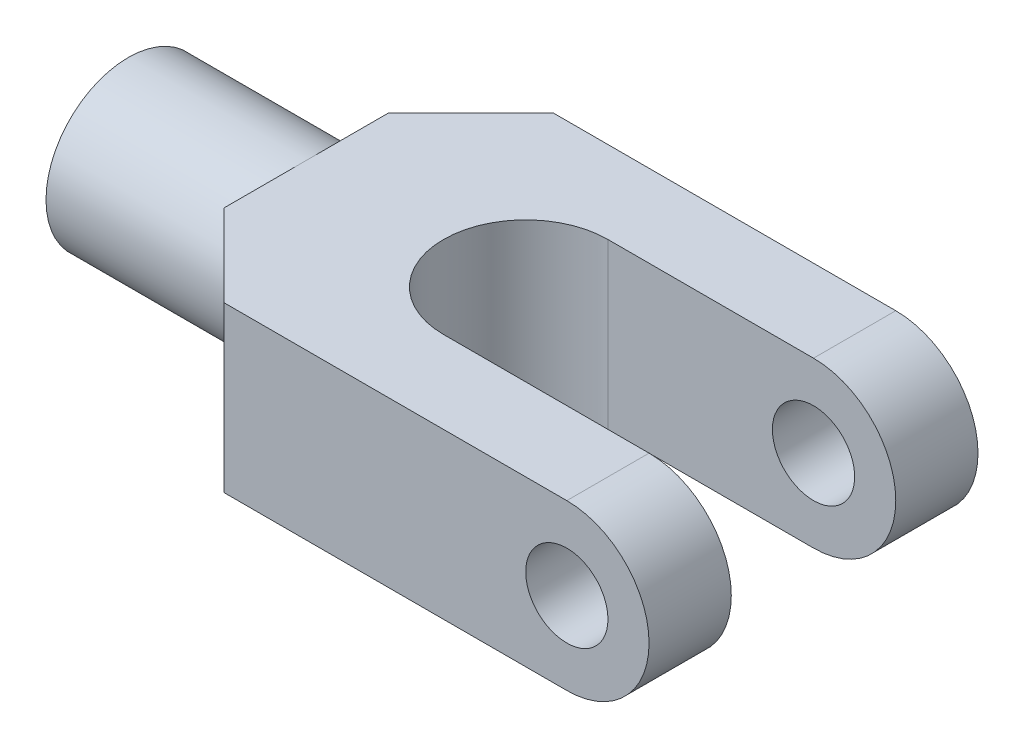
ISO-10303-21;
HEADER;
FILE_DESCRIPTION(('STEP AP214'),'2;1');
FILE_NAME('part.step','',(''),(''),'','','');
FILE_SCHEMA(('AUTOMOTIVE_DESIGN { 1 0 10303 214 1 1 1 1 }'));
ENDSEC;
DATA;
#1=APPLICATION_CONTEXT('core data for automotive mechanical design processes');
#2=APPLICATION_PROTOCOL_DEFINITION('international standard','automotive_design',2000,#1);
#3=PRODUCT_CONTEXT('',#1,'mechanical');
#4=PRODUCT('Part','Part','',(#3));
#5=PRODUCT_RELATED_PRODUCT_CATEGORY('part','',(#4));
#6=PRODUCT_DEFINITION_FORMATION('','',#4);
#7=PRODUCT_DEFINITION_CONTEXT('part definition',#1,'design');
#8=PRODUCT_DEFINITION('design','',#6,#7);
#9=PRODUCT_DEFINITION_SHAPE('','',#8);
#10=(LENGTH_UNIT() NAMED_UNIT(*) SI_UNIT(.MILLI.,.METRE.));
#11=(NAMED_UNIT(*) PLANE_ANGLE_UNIT() SI_UNIT($,.RADIAN.));
#12=(NAMED_UNIT(*) SI_UNIT($,.STERADIAN.) SOLID_ANGLE_UNIT());
#13=UNCERTAINTY_MEASURE_WITH_UNIT(LENGTH_MEASURE(1.E-05),#10,'distance_accuracy_value','');
#14=(GEOMETRIC_REPRESENTATION_CONTEXT(3) GLOBAL_UNCERTAINTY_ASSIGNED_CONTEXT((#13)) GLOBAL_UNIT_ASSIGNED_CONTEXT((#10,
#11,#12)) REPRESENTATION_CONTEXT('',''));
#15=CARTESIAN_POINT('',(0.,0.,0.));
#16=DIRECTION('',(0.,0.,1.));
#17=DIRECTION('',(1.,0.,0.));
#18=AXIS2_PLACEMENT_3D('',#15,#16,#17);
#19=CARTESIAN_POINT('',(-31.,-6.,12.));
#20=DIRECTION('',(1.,0.,0.));
#21=DIRECTION('',(0.,0.,-1.));
#22=AXIS2_PLACEMENT_3D('',#19,#20,#21);
#23=PLANE('',#22);
#24=CARTESIAN_POINT('',(-31.,0.,0.));
#25=DIRECTION('',(-1.,0.,0.));
#26=DIRECTION('',(0.,0.,1.));
#27=AXIS2_PLACEMENT_3D('',#24,#25,#26);
#28=CIRCLE('',#27,6.);
#29=CARTESIAN_POINT('',(-31.,0.,6.));
#30=VERTEX_POINT('',#29);
#31=CARTESIAN_POINT('',(-31.,6.,0.));
#32=VERTEX_POINT('',#31);
#33=EDGE_CURVE('E49',#30,#32,#28,.T.);
#34=ORIENTED_EDGE('',*,*,#33,.F.);
#35=DIRECTION('',(0.,1.,0.));
#36=VECTOR('',#35,1.);
#37=CARTESIAN_POINT('',(-31.,-6.,6.00000000000001));
#38=LINE('',#37,#36);
#39=CARTESIAN_POINT('',(-31.,6.,6.00000000000001));
#40=VERTEX_POINT('',#39);
#41=EDGE_CURVE('E136',#30,#40,#38,.T.);
#42=ORIENTED_EDGE('',*,*,#41,.T.);
#43=DIRECTION('',(0.,0.,-1.));
#44=VECTOR('',#43,1.);
#45=CARTESIAN_POINT('',(-31.,6.,12.));
#46=LINE('',#45,#44);
#47=EDGE_CURVE('E148',#40,#32,#46,.T.);
#48=ORIENTED_EDGE('',*,*,#47,.T.);
#49=EDGE_LOOP('',(#34,#42,#48));
#50=FACE_BOUND('',#49,.T.);
#51=ADVANCED_FACE('F38',(#50),#23,.F.);
#52=CARTESIAN_POINT('',(-31.,0.,-6.));
#53=VERTEX_POINT('',#52);
#54=EDGE_CURVE('E11',#32,#53,#28,.T.);
#55=ORIENTED_EDGE('',*,*,#54,.F.);
#56=CARTESIAN_POINT('',(-31.,6.,-6.));
#57=VERTEX_POINT('',#56);
#58=EDGE_CURVE('E232',#32,#57,#46,.T.);
#59=ORIENTED_EDGE('',*,*,#58,.T.);
#60=DIRECTION('',(0.,1.,0.));
#61=VECTOR('',#60,1.);
#62=CARTESIAN_POINT('',(-31.,-6.,-6.));
#63=LINE('',#62,#61);
#64=EDGE_CURVE('E188',#53,#57,#63,.T.);
#65=ORIENTED_EDGE('',*,*,#64,.F.);
#66=EDGE_LOOP('',(#55,#59,#65));
#67=FACE_BOUND('',#66,.T.);
#68=ADVANCED_FACE('F263',(#67),#23,.F.);
#69=CARTESIAN_POINT('',(-31.,-6.,0.));
#70=VERTEX_POINT('',#69);
#71=EDGE_CURVE('E47',#53,#70,#28,.T.);
#72=ORIENTED_EDGE('',*,*,#71,.F.);
#73=CARTESIAN_POINT('',(-31.,-6.,-6.));
#74=VERTEX_POINT('',#73);
#75=EDGE_CURVE('E191',#74,#53,#63,.T.);
#76=ORIENTED_EDGE('',*,*,#75,.F.);
#77=DIRECTION('',(0.,0.,-1.));
#78=VECTOR('',#77,1.);
#79=CARTESIAN_POINT('',(-31.,-6.,12.));
#80=LINE('',#79,#78);
#81=EDGE_CURVE('E230',#70,#74,#80,.T.);
#82=ORIENTED_EDGE('',*,*,#81,.F.);
#83=EDGE_LOOP('',(#72,#76,#82));
#84=FACE_BOUND('',#83,.T.);
#85=ADVANCED_FACE('F269',(#84),#23,.F.);
#86=CARTESIAN_POINT('',(0.,0.,12.));
#87=DIRECTION('',(0.,0.,-1.));
#88=DIRECTION('',(-1.,0.,0.));
#89=AXIS2_PLACEMENT_3D('',#86,#87,#88);
#90=CYLINDRICAL_SURFACE('',#89,6.);
#91=DIRECTION('',(0.,0.,-1.));
#92=VECTOR('',#91,1.);
#93=CARTESIAN_POINT('',(0.,6.,12.));
#94=LINE('',#93,#92);
#95=CARTESIAN_POINT('',(0.,6.,-6.));
#96=VERTEX_POINT('',#95);
#97=CARTESIAN_POINT('',(0.,6.,-12.));
#98=VERTEX_POINT('',#97);
#99=EDGE_CURVE('E155',#96,#98,#94,.T.);
#100=ORIENTED_EDGE('',*,*,#99,.F.);
#101=CARTESIAN_POINT('',(0.,0.,-6.));
#102=DIRECTION('',(0.,0.,-1.));
#103=DIRECTION('',(-1.,0.,0.));
#104=AXIS2_PLACEMENT_3D('',#101,#102,#103);
#105=CIRCLE('',#104,6.);
#106=CARTESIAN_POINT('',(0.,-6.,-6.));
#107=VERTEX_POINT('',#106);
#108=EDGE_CURVE('E201',#96,#107,#105,.T.);
#109=ORIENTED_EDGE('',*,*,#108,.T.);
#110=DIRECTION('',(0.,0.,-1.));
#111=VECTOR('',#110,1.);
#112=CARTESIAN_POINT('',(0.,-6.,12.));
#113=LINE('',#112,#111);
#114=CARTESIAN_POINT('',(0.,-6.,-12.));
#115=VERTEX_POINT('',#114);
#116=EDGE_CURVE('E219',#107,#115,#113,.T.);
#117=ORIENTED_EDGE('',*,*,#116,.T.);
#118=CARTESIAN_POINT('',(0.,0.,-12.));
#119=DIRECTION('',(0.,0.,1.));
#120=DIRECTION('',(1.,0.,0.));
#121=AXIS2_PLACEMENT_3D('',#118,#119,#120);
#122=CIRCLE('',#121,6.);
#123=EDGE_CURVE('E207',#115,#98,#122,.T.);
#124=ORIENTED_EDGE('',*,*,#123,.T.);
#125=EDGE_LOOP('',(#100,#109,#117,#124));
#126=FACE_BOUND('',#125,.T.);
#127=ADVANCED_FACE('F259',(#126),#90,.T.);
#128=CARTESIAN_POINT('',(0.,0.,12.));
#129=DIRECTION('',(0.,0.,-1.));
#130=DIRECTION('',(-1.,0.,0.));
#131=AXIS2_PLACEMENT_3D('',#128,#129,#130);
#132=CYLINDRICAL_SURFACE('',#131,3.);
#133=CARTESIAN_POINT('',(0.,0.,-6.));
#134=DIRECTION('',(0.,0.,-1.));
#135=DIRECTION('',(-1.,0.,0.));
#136=AXIS2_PLACEMENT_3D('',#133,#134,#135);
#137=CIRCLE('',#136,3.);
#138=CARTESIAN_POINT('',(-3.,0.,-6.));
#139=VERTEX_POINT('',#138);
#140=EDGE_CURVE('E42',#139,#139,#137,.T.);
#141=ORIENTED_EDGE('',*,*,#140,.F.);
#142=EDGE_LOOP('',(#141));
#143=FACE_BOUND('',#142,.T.);
#144=CARTESIAN_POINT('',(0.,0.,-12.));
#145=DIRECTION('',(0.,0.,1.));
#146=DIRECTION('',(1.,0.,0.));
#147=AXIS2_PLACEMENT_3D('',#144,#145,#146);
#148=CIRCLE('',#147,3.);
#149=CARTESIAN_POINT('',(3.,0.,-12.));
#150=VERTEX_POINT('',#149);
#151=EDGE_CURVE('E203',#150,#150,#148,.T.);
#152=ORIENTED_EDGE('',*,*,#151,.F.);
#153=EDGE_LOOP('',(#152));
#154=FACE_BOUND('',#153,.T.);
#155=ADVANCED_FACE('F245',(#143,#154),#132,.F.);
#156=CARTESIAN_POINT('',(0.,0.,12.));
#157=DIRECTION('',(0.,0.,1.));
#158=DIRECTION('',(1.,0.,0.));
#159=AXIS2_PLACEMENT_3D('',#156,#157,#158);
#160=PLANE('',#159);
#161=DIRECTION('',(0.,1.,0.));
#162=VECTOR('',#161,1.);
#163=CARTESIAN_POINT('',(-25.,-6.,12.));
#164=LINE('',#163,#162);
#165=CARTESIAN_POINT('',(-25.,-6.,12.));
#166=VERTEX_POINT('',#165);
#167=CARTESIAN_POINT('',(-25.,6.,12.));
#168=VERTEX_POINT('',#167);
#169=EDGE_CURVE('E146',#166,#168,#164,.T.);
#170=ORIENTED_EDGE('',*,*,#169,.F.);
#171=DIRECTION('',(1.,0.,0.));
#172=VECTOR('',#171,1.);
#173=CARTESIAN_POINT('',(0.,-6.,12.));
#174=LINE('',#173,#172);
#175=CARTESIAN_POINT('',(0.,-6.,12.));
#176=VERTEX_POINT('',#175);
#177=EDGE_CURVE('E217',#166,#176,#174,.T.);
#178=ORIENTED_EDGE('',*,*,#177,.T.);
#179=CARTESIAN_POINT('',(0.,0.,12.));
#180=DIRECTION('',(0.,0.,1.));
#181=DIRECTION('',(1.,0.,0.));
#182=AXIS2_PLACEMENT_3D('',#179,#180,#181);
#183=CIRCLE('',#182,6.);
#184=CARTESIAN_POINT('',(0.,6.,12.));
#185=VERTEX_POINT('',#184);
#186=EDGE_CURVE('E210',#176,#185,#183,.T.);
#187=ORIENTED_EDGE('',*,*,#186,.T.);
#188=DIRECTION('',(-1.,0.,0.));
#189=VECTOR('',#188,1.);
#190=CARTESIAN_POINT('',(-31.,6.,12.));
#191=LINE('',#190,#189);
#192=EDGE_CURVE('E213',#185,#168,#191,.T.);
#193=ORIENTED_EDGE('',*,*,#192,.T.);
#194=EDGE_LOOP('',(#170,#178,#187,#193));
#195=FACE_BOUND('',#194,.T.);
#196=CARTESIAN_POINT('',(0.,0.,12.));
#197=DIRECTION('',(0.,0.,1.));
#198=DIRECTION('',(1.,0.,0.));
#199=AXIS2_PLACEMENT_3D('',#196,#197,#198);
#200=CIRCLE('',#199,3.);
#201=CARTESIAN_POINT('',(3.,0.,12.));
#202=VERTEX_POINT('',#201);
#203=EDGE_CURVE('E204',#202,#202,#200,.T.);
#204=ORIENTED_EDGE('',*,*,#203,.F.);
#205=EDGE_LOOP('',(#204));
#206=FACE_BOUND('',#205,.T.);
#207=ADVANCED_FACE('F248',(#195,#206),#160,.T.);
#208=CARTESIAN_POINT('',(0.,0.,-12.));
#209=DIRECTION('',(0.,0.,1.));
#210=DIRECTION('',(1.,0.,0.));
#211=AXIS2_PLACEMENT_3D('',#208,#209,#210);
#212=PLANE('',#211);
#213=DIRECTION('',(1.,0.,0.));
#214=VECTOR('',#213,1.);
#215=CARTESIAN_POINT('',(0.,-6.,-12.));
#216=LINE('',#215,#214);
#217=CARTESIAN_POINT('',(-25.,-6.,-12.));
#218=VERTEX_POINT('',#217);
#219=EDGE_CURVE('E214',#218,#115,#216,.T.);
#220=ORIENTED_EDGE('',*,*,#219,.F.);
#221=DIRECTION('',(0.,1.,0.));
#222=VECTOR('',#221,1.);
#223=CARTESIAN_POINT('',(-25.,-6.,-12.));
#224=LINE('',#223,#222);
#225=CARTESIAN_POINT('',(-25.,6.,-12.));
#226=VERTEX_POINT('',#225);
#227=EDGE_CURVE('E164',#218,#226,#224,.T.);
#228=ORIENTED_EDGE('',*,*,#227,.T.);
#229=DIRECTION('',(-1.,0.,0.));
#230=VECTOR('',#229,1.);
#231=CARTESIAN_POINT('',(-31.,6.,-12.));
#232=LINE('',#231,#230);
#233=EDGE_CURVE('E222',#98,#226,#232,.T.);
#234=ORIENTED_EDGE('',*,*,#233,.F.);
#235=ORIENTED_EDGE('',*,*,#123,.F.);
#236=EDGE_LOOP('',(#220,#228,#234,#235));
#237=FACE_BOUND('',#236,.T.);
#238=ORIENTED_EDGE('',*,*,#151,.T.);
#239=EDGE_LOOP('',(#238));
#240=FACE_BOUND('',#239,.T.);
#241=ADVANCED_FACE('F250',(#237,#240),#212,.F.);
#242=CARTESIAN_POINT('',(0.,0.,6.));
#243=DIRECTION('',(0.,0.,1.));
#244=DIRECTION('',(1.,0.,0.));
#245=AXIS2_PLACEMENT_3D('',#242,#243,#244);
#246=CIRCLE('',#245,6.);
#247=CARTESIAN_POINT('',(0.,-6.,6.));
#248=VERTEX_POINT('',#247);
#249=CARTESIAN_POINT('',(0.,6.,6.));
#250=VERTEX_POINT('',#249);
#251=EDGE_CURVE('E199',#248,#250,#246,.T.);
#252=ORIENTED_EDGE('',*,*,#251,.T.);
#253=EDGE_CURVE('E153',#185,#250,#94,.T.);
#254=ORIENTED_EDGE('',*,*,#253,.F.);
#255=ORIENTED_EDGE('',*,*,#186,.F.);
#256=EDGE_CURVE('E227',#176,#248,#113,.T.);
#257=ORIENTED_EDGE('',*,*,#256,.T.);
#258=EDGE_LOOP('',(#252,#254,#255,#257));
#259=FACE_BOUND('',#258,.T.);
#260=ADVANCED_FACE('F40',(#259),#90,.T.);
#261=CARTESIAN_POINT('',(-31.,6.,12.));
#262=DIRECTION('',(0.,-1.,0.));
#263=DIRECTION('',(1.,0.,0.));
#264=AXIS2_PLACEMENT_3D('',#261,#262,#263);
#265=PLANE('',#264);
#266=CARTESIAN_POINT('',(-15.,6.,0.));
#267=DIRECTION('',(0.,1.,0.));
#268=DIRECTION('',(0.,0.,-1.));
#269=AXIS2_PLACEMENT_3D('',#266,#267,#268);
#270=CIRCLE('',#269,6.);
#271=CARTESIAN_POINT('',(-14.9999999999942,6.,-6.));
#272=VERTEX_POINT('',#271);
#273=CARTESIAN_POINT('',(-14.9999999999942,6.,6.));
#274=VERTEX_POINT('',#273);
#275=EDGE_CURVE('E160',#272,#274,#270,.T.);
#276=ORIENTED_EDGE('',*,*,#275,.F.);
#277=DIRECTION('',(-1.,0.,0.));
#278=VECTOR('',#277,1.);
#279=CARTESIAN_POINT('',(-14.9999999999942,6.,-6.));
#280=LINE('',#279,#278);
#281=EDGE_CURVE('E167',#96,#272,#280,.T.);
#282=ORIENTED_EDGE('',*,*,#281,.F.);
#283=ORIENTED_EDGE('',*,*,#99,.T.);
#284=ORIENTED_EDGE('',*,*,#233,.T.);
#285=DIRECTION('',(0.707106781186547,0.,-0.707106781186548));
#286=VECTOR('',#285,1.);
#287=CARTESIAN_POINT('',(-31.,6.,-6.));
#288=LINE('',#287,#286);
#289=EDGE_CURVE('E135',#57,#226,#288,.T.);
#290=ORIENTED_EDGE('',*,*,#289,.F.);
#291=ORIENTED_EDGE('',*,*,#58,.F.);
#292=ORIENTED_EDGE('',*,*,#47,.F.);
#293=DIRECTION('',(-0.707106781186548,0.,-0.707106781186547));
#294=VECTOR('',#293,1.);
#295=CARTESIAN_POINT('',(-31.,6.,6.00000000000001));
#296=LINE('',#295,#294);
#297=EDGE_CURVE('E142',#168,#40,#296,.T.);
#298=ORIENTED_EDGE('',*,*,#297,.F.);
#299=ORIENTED_EDGE('',*,*,#192,.F.);
#300=ORIENTED_EDGE('',*,*,#253,.T.);
#301=DIRECTION('',(1.,0.,0.));
#302=VECTOR('',#301,1.);
#303=CARTESIAN_POINT('',(6.,6.,6.));
#304=LINE('',#303,#302);
#305=EDGE_CURVE('E163',#274,#250,#304,.T.);
#306=ORIENTED_EDGE('',*,*,#305,.F.);
#307=EDGE_LOOP('',(#276,#282,#283,#284,#290,#291,#292,#298,#299,#300,#306));
#308=FACE_BOUND('',#307,.T.);
#309=ADVANCED_FACE('F282',(#308),#265,.F.);
#310=EDGE_CURVE('E56',#70,#30,#28,.T.);
#311=ORIENTED_EDGE('',*,*,#310,.F.);
#312=CARTESIAN_POINT('',(-31.,-6.,6.00000000000001));
#313=VERTEX_POINT('',#312);
#314=EDGE_CURVE('E132',#313,#70,#80,.T.);
#315=ORIENTED_EDGE('',*,*,#314,.F.);
#316=EDGE_CURVE('E128',#313,#30,#38,.T.);
#317=ORIENTED_EDGE('',*,*,#316,.T.);
#318=EDGE_LOOP('',(#311,#315,#317));
#319=FACE_BOUND('',#318,.T.);
#320=ADVANCED_FACE('F130',(#319),#23,.F.);
#321=CARTESIAN_POINT('',(0.,-6.,12.));
#322=DIRECTION('',(0.,1.,0.));
#323=DIRECTION('',(-1.,0.,0.));
#324=AXIS2_PLACEMENT_3D('',#321,#322,#323);
#325=PLANE('',#324);
#326=ORIENTED_EDGE('',*,*,#116,.F.);
#327=DIRECTION('',(-1.,0.,0.));
#328=VECTOR('',#327,1.);
#329=CARTESIAN_POINT('',(-14.9999999999942,-6.,-6.));
#330=LINE('',#329,#328);
#331=CARTESIAN_POINT('',(-14.9999999999942,-6.,-6.));
#332=VERTEX_POINT('',#331);
#333=EDGE_CURVE('E175',#107,#332,#330,.T.);
#334=ORIENTED_EDGE('',*,*,#333,.T.);
#335=CARTESIAN_POINT('',(-15.,-6.,0.));
#336=DIRECTION('',(0.,1.,0.));
#337=DIRECTION('',(0.,0.,-1.));
#338=AXIS2_PLACEMENT_3D('',#335,#336,#337);
#339=CIRCLE('',#338,6.);
#340=CARTESIAN_POINT('',(-14.9999999999942,-6.,6.));
#341=VERTEX_POINT('',#340);
#342=EDGE_CURVE('E169',#332,#341,#339,.T.);
#343=ORIENTED_EDGE('',*,*,#342,.T.);
#344=DIRECTION('',(1.,0.,0.));
#345=VECTOR('',#344,1.);
#346=CARTESIAN_POINT('',(6.,-6.,6.));
#347=LINE('',#346,#345);
#348=EDGE_CURVE('E172',#341,#248,#347,.T.);
#349=ORIENTED_EDGE('',*,*,#348,.T.);
#350=ORIENTED_EDGE('',*,*,#256,.F.);
#351=ORIENTED_EDGE('',*,*,#177,.F.);
#352=DIRECTION('',(-0.707106781186548,0.,-0.707106781186547));
#353=VECTOR('',#352,1.);
#354=CARTESIAN_POINT('',(-31.,-6.,6.00000000000001));
#355=LINE('',#354,#353);
#356=EDGE_CURVE('E195',#166,#313,#355,.T.);
#357=ORIENTED_EDGE('',*,*,#356,.T.);
#358=ORIENTED_EDGE('',*,*,#314,.T.);
#359=ORIENTED_EDGE('',*,*,#81,.T.);
#360=DIRECTION('',(0.707106781186547,0.,-0.707106781186548));
#361=VECTOR('',#360,1.);
#362=CARTESIAN_POINT('',(-31.,-6.,-6.));
#363=LINE('',#362,#361);
#364=EDGE_CURVE('E185',#74,#218,#363,.T.);
#365=ORIENTED_EDGE('',*,*,#364,.T.);
#366=ORIENTED_EDGE('',*,*,#219,.T.);
#367=EDGE_LOOP('',(#326,#334,#343,#349,#350,#351,#357,#358,#359,#365,#366));
#368=FACE_BOUND('',#367,.T.);
#369=ADVANCED_FACE('F243',(#368),#325,.F.);
#370=CARTESIAN_POINT('',(0.,0.,6.));
#371=DIRECTION('',(0.,0.,1.));
#372=DIRECTION('',(1.,0.,0.));
#373=AXIS2_PLACEMENT_3D('',#370,#371,#372);
#374=CIRCLE('',#373,3.);
#375=CARTESIAN_POINT('',(3.,0.,6.));
#376=VERTEX_POINT('',#375);
#377=EDGE_CURVE('E182',#376,#376,#374,.T.);
#378=ORIENTED_EDGE('',*,*,#377,.F.);
#379=EDGE_LOOP('',(#378));
#380=FACE_BOUND('',#379,.T.);
#381=ORIENTED_EDGE('',*,*,#203,.T.);
#382=EDGE_LOOP('',(#381));
#383=FACE_BOUND('',#382,.T.);
#384=ADVANCED_FACE('F239',(#380,#383),#132,.F.);
#385=CARTESIAN_POINT('',(-14.9999999999942,-6.,-6.));
#386=DIRECTION('',(0.,0.,-1.));
#387=DIRECTION('',(-1.,0.,0.));
#388=AXIS2_PLACEMENT_3D('',#385,#386,#387);
#389=PLANE('',#388);
#390=ORIENTED_EDGE('',*,*,#140,.T.);
#391=EDGE_LOOP('',(#390));
#392=FACE_BOUND('',#391,.T.);
#393=ORIENTED_EDGE('',*,*,#281,.T.);
#394=DIRECTION('',(0.,1.,0.));
#395=VECTOR('',#394,1.);
#396=CARTESIAN_POINT('',(-14.9999999999942,-6.,-6.));
#397=LINE('',#396,#395);
#398=EDGE_CURVE('E179',#332,#272,#397,.T.);
#399=ORIENTED_EDGE('',*,*,#398,.F.);
#400=ORIENTED_EDGE('',*,*,#333,.F.);
#401=ORIENTED_EDGE('',*,*,#108,.F.);
#402=EDGE_LOOP('',(#393,#399,#400,#401));
#403=FACE_BOUND('',#402,.T.);
#404=ADVANCED_FACE('F242',(#392,#403),#389,.F.);
#405=CARTESIAN_POINT('',(6.,-6.,6.));
#406=DIRECTION('',(0.,0.,1.));
#407=DIRECTION('',(1.,0.,0.));
#408=AXIS2_PLACEMENT_3D('',#405,#406,#407);
#409=PLANE('',#408);
#410=ORIENTED_EDGE('',*,*,#377,.T.);
#411=EDGE_LOOP('',(#410));
#412=FACE_BOUND('',#411,.T.);
#413=ORIENTED_EDGE('',*,*,#251,.F.);
#414=ORIENTED_EDGE('',*,*,#348,.F.);
#415=DIRECTION('',(0.,1.,0.));
#416=VECTOR('',#415,1.);
#417=CARTESIAN_POINT('',(-14.9999999999942,-6.,6.));
#418=LINE('',#417,#416);
#419=EDGE_CURVE('E178',#341,#274,#418,.T.);
#420=ORIENTED_EDGE('',*,*,#419,.T.);
#421=ORIENTED_EDGE('',*,*,#305,.T.);
#422=EDGE_LOOP('',(#413,#414,#420,#421));
#423=FACE_BOUND('',#422,.T.);
#424=ADVANCED_FACE('F236',(#412,#423),#409,.F.);
#425=CARTESIAN_POINT('',(-15.,-6.,0.));
#426=DIRECTION('',(0.,1.,0.));
#427=DIRECTION('',(0.,0.,1.));
#428=AXIS2_PLACEMENT_3D('',#425,#426,#427);
#429=CYLINDRICAL_SURFACE('',#428,6.);
#430=ORIENTED_EDGE('',*,*,#419,.F.);
#431=ORIENTED_EDGE('',*,*,#342,.F.);
#432=ORIENTED_EDGE('',*,*,#398,.T.);
#433=ORIENTED_EDGE('',*,*,#275,.T.);
#434=EDGE_LOOP('',(#430,#431,#432,#433));
#435=FACE_BOUND('',#434,.T.);
#436=ADVANCED_FACE('F312',(#435),#429,.F.);
#437=CARTESIAN_POINT('',(-31.,-6.,6.00000000000001));
#438=DIRECTION('',(0.707106781186547,0.,-0.707106781186548));
#439=DIRECTION('',(-0.707106781186548,0.,-0.707106781186547));
#440=AXIS2_PLACEMENT_3D('',#437,#438,#439);
#441=PLANE('',#440);
#442=ORIENTED_EDGE('',*,*,#316,.F.);
#443=ORIENTED_EDGE('',*,*,#356,.F.);
#444=ORIENTED_EDGE('',*,*,#169,.T.);
#445=ORIENTED_EDGE('',*,*,#297,.T.);
#446=ORIENTED_EDGE('',*,*,#41,.F.);
#447=EDGE_LOOP('',(#442,#443,#444,#445,#446));
#448=FACE_BOUND('',#447,.T.);
#449=ADVANCED_FACE('F140',(#448),#441,.F.);
#450=CARTESIAN_POINT('',(-31.,-6.,-6.));
#451=DIRECTION('',(0.707106781186548,0.,0.707106781186547));
#452=DIRECTION('',(0.707106781186547,0.,-0.707106781186548));
#453=AXIS2_PLACEMENT_3D('',#450,#451,#452);
#454=PLANE('',#453);
#455=ORIENTED_EDGE('',*,*,#227,.F.);
#456=ORIENTED_EDGE('',*,*,#364,.F.);
#457=ORIENTED_EDGE('',*,*,#75,.T.);
#458=ORIENTED_EDGE('',*,*,#64,.T.);
#459=ORIENTED_EDGE('',*,*,#289,.T.);
#460=EDGE_LOOP('',(#455,#456,#457,#458,#459));
#461=FACE_BOUND('',#460,.T.);
#462=ADVANCED_FACE('F323',(#461),#454,.F.);
#463=CARTESIAN_POINT('',(-44.,0.,0.));
#464=DIRECTION('',(1.,0.,0.));
#465=DIRECTION('',(0.,0.,-1.));
#466=AXIS2_PLACEMENT_3D('',#463,#464,#465);
#467=CYLINDRICAL_SURFACE('',#466,3.);
#468=CARTESIAN_POINT('',(-44.,0.,0.));
#469=DIRECTION('',(-1.,0.,0.));
#470=DIRECTION('',(0.,0.,1.));
#471=AXIS2_PLACEMENT_3D('',#468,#469,#470);
#472=CIRCLE('',#471,3.);
#473=CARTESIAN_POINT('',(-44.,0.,-3.));
#474=VERTEX_POINT('',#473);
#475=EDGE_CURVE('E150',#474,#474,#472,.T.);
#476=CARTESIAN_POINT('',(-31.,0.,0.));
#477=DIRECTION('',(-1.,0.,0.));
#478=DIRECTION('',(0.,0.,1.));
#479=AXIS2_PLACEMENT_3D('',#476,#477,#478);
#480=CIRCLE('',#479,3.);
#481=CARTESIAN_POINT('',(-31.,0.,-3.));
#482=VERTEX_POINT('',#481);
#483=EDGE_CURVE('E151',#482,#482,#480,.T.);
#484=CARTESIAN_POINT('',(-44.,0.,-3.));
#485=CARTESIAN_POINT('',(-43.8645833333333,0.,-3.));
#486=CARTESIAN_POINT('',(-43.7291666666667,0.,-3.));
#487=CARTESIAN_POINT('',(-43.4583333333333,0.,-3.));
#488=CARTESIAN_POINT('',(-43.3229166666667,0.,-3.));
#489=CARTESIAN_POINT('',(-43.0520833333333,0.,-3.));
#490=CARTESIAN_POINT('',(-42.9166666666667,0.,-3.));
#491=CARTESIAN_POINT('',(-42.6458333333333,0.,-3.));
#492=CARTESIAN_POINT('',(-42.5104166666667,0.,-3.));
#493=CARTESIAN_POINT('',(-42.2395833333333,0.,-3.));
#494=CARTESIAN_POINT('',(-42.1041666666667,0.,-3.));
#495=CARTESIAN_POINT('',(-41.8333333333333,0.,-3.));
#496=CARTESIAN_POINT('',(-41.6979166666667,0.,-3.));
#497=CARTESIAN_POINT('',(-41.4270833333333,0.,-3.));
#498=CARTESIAN_POINT('',(-41.2916666666667,0.,-3.));
#499=CARTESIAN_POINT('',(-41.0208333333333,0.,-3.));
#500=CARTESIAN_POINT('',(-40.8854166666667,0.,-3.));
#501=CARTESIAN_POINT('',(-40.6145833333333,0.,-3.));
#502=CARTESIAN_POINT('',(-40.4791666666667,0.,-3.));
#503=CARTESIAN_POINT('',(-40.2083333333333,0.,-3.));
#504=CARTESIAN_POINT('',(-40.0729166666667,0.,-3.));
#505=CARTESIAN_POINT('',(-39.8020833333333,0.,-3.));
#506=CARTESIAN_POINT('',(-39.6666666666667,0.,-3.));
#507=CARTESIAN_POINT('',(-39.3958333333333,0.,-3.));
#508=CARTESIAN_POINT('',(-39.2604166666667,0.,-3.));
#509=CARTESIAN_POINT('',(-38.9895833333333,0.,-3.));
#510=CARTESIAN_POINT('',(-38.8541666666667,0.,-3.));
#511=CARTESIAN_POINT('',(-38.5833333333333,0.,-3.));
#512=CARTESIAN_POINT('',(-38.4479166666667,0.,-3.));
#513=CARTESIAN_POINT('',(-38.1770833333333,0.,-3.));
#514=CARTESIAN_POINT('',(-38.0416666666667,0.,-3.));
#515=CARTESIAN_POINT('',(-37.7708333333333,0.,-3.));
#516=CARTESIAN_POINT('',(-37.6354166666667,0.,-3.));
#517=CARTESIAN_POINT('',(-37.3645833333333,0.,-3.));
#518=CARTESIAN_POINT('',(-37.2291666666667,0.,-3.));
#519=CARTESIAN_POINT('',(-36.9583333333333,0.,-3.));
#520=CARTESIAN_POINT('',(-36.8229166666667,0.,-3.));
#521=CARTESIAN_POINT('',(-36.5520833333333,0.,-3.));
#522=CARTESIAN_POINT('',(-36.4166666666667,0.,-3.));
#523=CARTESIAN_POINT('',(-36.1458333333333,0.,-3.));
#524=CARTESIAN_POINT('',(-36.0104166666667,0.,-3.));
#525=CARTESIAN_POINT('',(-35.7395833333333,0.,-3.));
#526=CARTESIAN_POINT('',(-35.6041666666667,0.,-3.));
#527=CARTESIAN_POINT('',(-35.3333333333333,0.,-3.));
#528=CARTESIAN_POINT('',(-35.1979166666667,0.,-3.));
#529=CARTESIAN_POINT('',(-34.9270833333333,0.,-3.));
#530=CARTESIAN_POINT('',(-34.7916666666667,0.,-3.));
#531=CARTESIAN_POINT('',(-34.5208333333333,0.,-3.));
#532=CARTESIAN_POINT('',(-34.3854166666667,0.,-3.));
#533=CARTESIAN_POINT('',(-34.1145833333333,0.,-3.));
#534=CARTESIAN_POINT('',(-33.9791666666667,0.,-3.));
#535=CARTESIAN_POINT('',(-33.7083333333333,0.,-3.));
#536=CARTESIAN_POINT('',(-33.5729166666667,0.,-3.));
#537=CARTESIAN_POINT('',(-33.3020833333333,0.,-3.));
#538=CARTESIAN_POINT('',(-33.1666666666667,0.,-3.));
#539=CARTESIAN_POINT('',(-32.8958333333333,0.,-3.));
#540=CARTESIAN_POINT('',(-32.7604166666667,0.,-3.));
#541=CARTESIAN_POINT('',(-32.4895833333333,0.,-3.));
#542=CARTESIAN_POINT('',(-32.3541666666667,0.,-3.));
#543=CARTESIAN_POINT('',(-32.0833333333333,0.,-3.));
#544=CARTESIAN_POINT('',(-31.9479166666667,0.,-3.));
#545=CARTESIAN_POINT('',(-31.6770833333333,0.,-3.));
#546=CARTESIAN_POINT('',(-31.5416666666667,0.,-3.));
#547=CARTESIAN_POINT('',(-31.2708333333333,0.,-3.));
#548=CARTESIAN_POINT('',(-31.1354166666667,0.,-3.));
#549=CARTESIAN_POINT('',(-31.,0.,-3.));
#550=B_SPLINE_CURVE_WITH_KNOTS('',3,(#484,#485,#486,#487,#488,#489,#490,#491,#492,#493,#494,
#495,#496,#497,#498,#499,#500,#501,#502,#503,#504,#505,#506,#507,#508,#509,#510,#511,#512,#513,
#514,#515,#516,#517,#518,#519,#520,#521,#522,#523,#524,#525,#526,#527,#528,#529,#530,#531,#532,
#533,#534,#535,#536,#537,#538,#539,#540,#541,#542,#543,#544,#545,#546,#547,#548,#549),
.UNSPECIFIED.,.F.,.F.,(4,2,2,2,2,2,2,2,2,2,2,2,2,2,2,2,2,2,2,2,2,2,2,2,2,2,2,2,2,2,2,2,4),(0.,
0.406250000000004,0.812500000000001,1.21875,1.625,2.03125000000001,2.4375,2.84375000000001,3.25,
3.65625,4.0625,4.46875,4.875,5.28125,5.6875,6.09375,6.5,6.90625,7.3125,7.71875,8.125,8.53125,
8.9375,9.34375,9.75,10.15625,10.5625,10.96875,11.375,11.78125,12.1875,12.59375,13.),.UNSPECIFIED.);
#551=EDGE_CURVE('BSEAM326',#474,#482,#550,.T.);
#552=ORIENTED_EDGE('',*,*,#475,.T.);
#553=ORIENTED_EDGE('',*,*,#483,.F.);
#554=ORIENTED_EDGE('',*,*,#551,.T.);
#555=ORIENTED_EDGE('',*,*,#551,.F.);
#556=EDGE_LOOP('',(#552,#554,#553,#555));
#557=FACE_BOUND('',#556,.T.);
#558=ADVANCED_FACE('F326',(#557),#467,.F.);
#559=CARTESIAN_POINT('',(-44.,0.,0.));
#560=DIRECTION('',(1.,0.,0.));
#561=DIRECTION('',(0.,0.,-1.));
#562=AXIS2_PLACEMENT_3D('',#559,#560,#561);
#563=CYLINDRICAL_SURFACE('',#562,6.);
#564=CARTESIAN_POINT('',(-44.,0.,0.));
#565=DIRECTION('',(-1.,0.,0.));
#566=DIRECTION('',(0.,0.,1.));
#567=AXIS2_PLACEMENT_3D('',#564,#565,#566);
#568=CIRCLE('',#567,6.);
#569=CARTESIAN_POINT('',(-44.,0.,6.));
#570=VERTEX_POINT('',#569);
#571=EDGE_CURVE('E196',#570,#570,#568,.T.);
#572=ORIENTED_EDGE('',*,*,#571,.F.);
#573=EDGE_LOOP('',(#572));
#574=FACE_BOUND('',#573,.T.);
#575=ORIENTED_EDGE('',*,*,#33,.T.);
#576=ORIENTED_EDGE('',*,*,#54,.T.);
#577=ORIENTED_EDGE('',*,*,#71,.T.);
#578=ORIENTED_EDGE('',*,*,#310,.T.);
#579=EDGE_LOOP('',(#575,#576,#577,#578));
#580=FACE_BOUND('',#579,.T.);
#581=ADVANCED_FACE('F152',(#574,#580),#563,.T.);
#582=CARTESIAN_POINT('',(-44.,0.,0.));
#583=DIRECTION('',(-1.,0.,0.));
#584=DIRECTION('',(0.,0.,1.));
#585=AXIS2_PLACEMENT_3D('',#582,#583,#584);
#586=PLANE('',#585);
#587=ORIENTED_EDGE('',*,*,#475,.F.);
#588=EDGE_LOOP('',(#587));
#589=FACE_BOUND('',#588,.T.);
#590=ORIENTED_EDGE('',*,*,#571,.T.);
#591=EDGE_LOOP('',(#590));
#592=FACE_BOUND('',#591,.T.);
#593=ADVANCED_FACE('F273',(#589,#592),#586,.T.);
#594=ORIENTED_EDGE('',*,*,#483,.T.);
#595=EDGE_LOOP('',(#594));
#596=FACE_BOUND('',#595,.T.);
#597=ADVANCED_FACE('F265',(#596),#23,.F.);
#598=CLOSED_SHELL('',(#51,#68,#85,#127,#155,#207,#241,#260,#309,#320,#369,#384,#404,#424,#436,
#449,#462,#558,#581,#593,#597));
#599=MANIFOLD_SOLID_BREP('B2',#598);
#600=ADVANCED_BREP_SHAPE_REPRESENTATION('',(#18,#599),#14);
#601=SHAPE_DEFINITION_REPRESENTATION(#9,#600);
ENDSEC;
END-ISO-10303-21;
